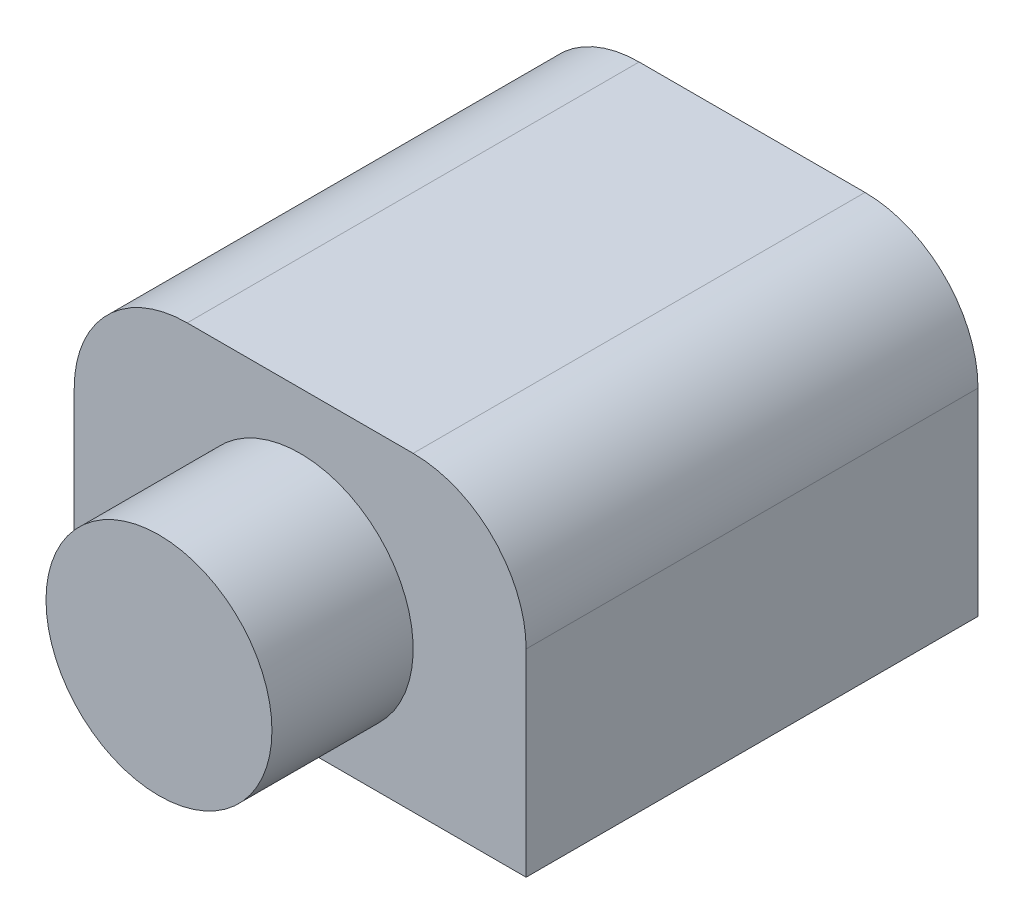
ISO-10303-21;
HEADER;
FILE_DESCRIPTION(('STEP AP214'),'2;1');
FILE_NAME('part.step','',(''),(''),'','','');
FILE_SCHEMA(('AUTOMOTIVE_DESIGN { 1 0 10303 214 1 1 1 1 }'));
ENDSEC;
DATA;
#1=APPLICATION_CONTEXT('core data for automotive mechanical design processes');
#2=APPLICATION_PROTOCOL_DEFINITION('international standard','automotive_design',2000,#1);
#3=PRODUCT_CONTEXT('',#1,'mechanical');
#4=PRODUCT('Part','Part','',(#3));
#5=PRODUCT_RELATED_PRODUCT_CATEGORY('part','',(#4));
#6=PRODUCT_DEFINITION_FORMATION('','',#4);
#7=PRODUCT_DEFINITION_CONTEXT('part definition',#1,'design');
#8=PRODUCT_DEFINITION('design','',#6,#7);
#9=PRODUCT_DEFINITION_SHAPE('','',#8);
#10=(LENGTH_UNIT() NAMED_UNIT(*) SI_UNIT(.MILLI.,.METRE.));
#11=(NAMED_UNIT(*) PLANE_ANGLE_UNIT() SI_UNIT($,.RADIAN.));
#12=(NAMED_UNIT(*) SI_UNIT($,.STERADIAN.) SOLID_ANGLE_UNIT());
#13=UNCERTAINTY_MEASURE_WITH_UNIT(LENGTH_MEASURE(1.E-05),#10,'distance_accuracy_value','');
#14=(GEOMETRIC_REPRESENTATION_CONTEXT(3) GLOBAL_UNCERTAINTY_ASSIGNED_CONTEXT((#13)) GLOBAL_UNIT_ASSIGNED_CONTEXT((#10,
#11,#12)) REPRESENTATION_CONTEXT('',''));
#15=CARTESIAN_POINT('',(0.,0.,0.));
#16=DIRECTION('',(0.,0.,1.));
#17=DIRECTION('',(1.,0.,0.));
#18=AXIS2_PLACEMENT_3D('',#15,#16,#17);
#19=CARTESIAN_POINT('',(-40.,190.,40.));
#20=DIRECTION('',(1.,0.,0.));
#21=DIRECTION('',(0.,0.,-1.));
#22=AXIS2_PLACEMENT_3D('',#19,#20,#21);
#23=PLANE('',#22);
#24=DIRECTION('',(0.,-1.,0.));
#25=VECTOR('',#24,1.);
#26=CARTESIAN_POINT('',(-40.,190.,-40.));
#27=LINE('',#26,#25);
#28=CARTESIAN_POINT('',(-40.,170.,-40.));
#29=VERTEX_POINT('',#28);
#30=CARTESIAN_POINT('',(-40.,135.,-40.));
#31=VERTEX_POINT('',#30);
#32=EDGE_CURVE('E112',#29,#31,#27,.T.);
#33=ORIENTED_EDGE('',*,*,#32,.T.);
#34=DIRECTION('',(0.,0.,1.));
#35=VECTOR('',#34,1.);
#36=CARTESIAN_POINT('',(-40.,135.,40.));
#37=LINE('',#36,#35);
#38=CARTESIAN_POINT('',(-40.,135.,40.));
#39=VERTEX_POINT('',#38);
#40=EDGE_CURVE('E61',#31,#39,#37,.T.);
#41=ORIENTED_EDGE('',*,*,#40,.T.);
#42=DIRECTION('',(0.,-1.,0.));
#43=VECTOR('',#42,1.);
#44=CARTESIAN_POINT('',(-40.,190.,40.));
#45=LINE('',#44,#43);
#46=CARTESIAN_POINT('',(-40.,170.,40.));
#47=VERTEX_POINT('',#46);
#48=EDGE_CURVE('E114',#47,#39,#45,.T.);
#49=ORIENTED_EDGE('',*,*,#48,.F.);
#50=DIRECTION('',(0.,0.,1.));
#51=VECTOR('',#50,1.);
#52=CARTESIAN_POINT('',(-40.,170.,-40.));
#53=LINE('',#52,#51);
#54=EDGE_CURVE('E132',#47,#29,#53,.F.);
#55=ORIENTED_EDGE('',*,*,#54,.T.);
#56=EDGE_LOOP('',(#33,#41,#49,#55));
#57=FACE_BOUND('',#56,.T.);
#58=ADVANCED_FACE('F46',(#57),#23,.F.);
#59=CARTESIAN_POINT('',(40.,190.,40.));
#60=DIRECTION('',(0.,0.,-1.));
#61=DIRECTION('',(-1.,0.,0.));
#62=AXIS2_PLACEMENT_3D('',#59,#60,#61);
#63=PLANE('',#62);
#64=CARTESIAN_POINT('',(0.,160.,40.));
#65=DIRECTION('',(0.,0.,-1.));
#66=DIRECTION('',(-1.,0.,0.));
#67=AXIS2_PLACEMENT_3D('',#64,#65,#66);
#68=CIRCLE('',#67,20.);
#69=CARTESIAN_POINT('',(-20.,160.,40.));
#70=VERTEX_POINT('',#69);
#71=EDGE_CURVE('E54',#70,#70,#68,.F.);
#72=ORIENTED_EDGE('',*,*,#71,.F.);
#73=EDGE_LOOP('',(#72));
#74=FACE_BOUND('',#73,.T.);
#75=ORIENTED_EDGE('',*,*,#48,.T.);
#76=DIRECTION('',(1.,0.,0.));
#77=VECTOR('',#76,1.);
#78=CARTESIAN_POINT('',(40.,135.,40.));
#79=LINE('',#78,#77);
#80=CARTESIAN_POINT('',(40.,135.,40.));
#81=VERTEX_POINT('',#80);
#82=EDGE_CURVE('E109',#39,#81,#79,.T.);
#83=ORIENTED_EDGE('',*,*,#82,.T.);
#84=DIRECTION('',(0.,-1.,0.));
#85=VECTOR('',#84,1.);
#86=CARTESIAN_POINT('',(40.,190.,40.));
#87=LINE('',#86,#85);
#88=CARTESIAN_POINT('',(40.,170.,40.));
#89=VERTEX_POINT('',#88);
#90=EDGE_CURVE('E108',#89,#81,#87,.T.);
#91=ORIENTED_EDGE('',*,*,#90,.F.);
#92=CARTESIAN_POINT('',(20.,170.,40.));
#93=DIRECTION('',(0.,0.,-1.));
#94=DIRECTION('',(-1.,0.,0.));
#95=AXIS2_PLACEMENT_3D('',#92,#93,#94);
#96=CIRCLE('',#95,20.);
#97=CARTESIAN_POINT('',(20.,190.,40.));
#98=VERTEX_POINT('',#97);
#99=EDGE_CURVE('E128',#89,#98,#96,.F.);
#100=ORIENTED_EDGE('',*,*,#99,.T.);
#101=DIRECTION('',(1.,0.,0.));
#102=VECTOR('',#101,1.);
#103=CARTESIAN_POINT('',(40.,190.,40.));
#104=LINE('',#103,#102);
#105=CARTESIAN_POINT('',(-20.,190.,40.));
#106=VERTEX_POINT('',#105);
#107=EDGE_CURVE('E160',#106,#98,#104,.T.);
#108=ORIENTED_EDGE('',*,*,#107,.F.);
#109=CARTESIAN_POINT('',(-20.,170.,40.));
#110=DIRECTION('',(0.,0.,-1.));
#111=DIRECTION('',(-1.,0.,0.));
#112=AXIS2_PLACEMENT_3D('',#109,#110,#111);
#113=CIRCLE('',#112,20.);
#114=EDGE_CURVE('E130',#106,#47,#113,.F.);
#115=ORIENTED_EDGE('',*,*,#114,.T.);
#116=EDGE_LOOP('',(#75,#83,#91,#100,#108,#115));
#117=FACE_BOUND('',#116,.T.);
#118=ADVANCED_FACE('F143',(#74,#117),#63,.F.);
#119=CARTESIAN_POINT('',(40.,190.,40.));
#120=DIRECTION('',(-1.,0.,0.));
#121=DIRECTION('',(0.,0.,1.));
#122=AXIS2_PLACEMENT_3D('',#119,#120,#121);
#123=PLANE('',#122);
#124=ORIENTED_EDGE('',*,*,#90,.T.);
#125=DIRECTION('',(0.,0.,-1.));
#126=VECTOR('',#125,1.);
#127=CARTESIAN_POINT('',(40.,135.,40.));
#128=LINE('',#127,#126);
#129=CARTESIAN_POINT('',(40.,135.,-40.));
#130=VERTEX_POINT('',#129);
#131=EDGE_CURVE('E98',#81,#130,#128,.T.);
#132=ORIENTED_EDGE('',*,*,#131,.T.);
#133=DIRECTION('',(0.,-1.,0.));
#134=VECTOR('',#133,1.);
#135=CARTESIAN_POINT('',(40.,190.,-40.));
#136=LINE('',#135,#134);
#137=CARTESIAN_POINT('',(40.,170.,-40.));
#138=VERTEX_POINT('',#137);
#139=EDGE_CURVE('E105',#138,#130,#136,.T.);
#140=ORIENTED_EDGE('',*,*,#139,.F.);
#141=DIRECTION('',(0.,0.,-1.));
#142=VECTOR('',#141,1.);
#143=CARTESIAN_POINT('',(40.,170.,40.));
#144=LINE('',#143,#142);
#145=EDGE_CURVE('E137',#138,#89,#144,.F.);
#146=ORIENTED_EDGE('',*,*,#145,.T.);
#147=EDGE_LOOP('',(#124,#132,#140,#146));
#148=FACE_BOUND('',#147,.T.);
#149=ADVANCED_FACE('F104',(#148),#123,.F.);
#150=CARTESIAN_POINT('',(40.,190.,-40.));
#151=DIRECTION('',(0.,0.,1.));
#152=DIRECTION('',(1.,0.,0.));
#153=AXIS2_PLACEMENT_3D('',#150,#151,#152);
#154=PLANE('',#153);
#155=ORIENTED_EDGE('',*,*,#139,.T.);
#156=DIRECTION('',(-1.,0.,0.));
#157=VECTOR('',#156,1.);
#158=CARTESIAN_POINT('',(40.,135.,-40.));
#159=LINE('',#158,#157);
#160=EDGE_CURVE('E12',#130,#31,#159,.T.);
#161=ORIENTED_EDGE('',*,*,#160,.T.);
#162=ORIENTED_EDGE('',*,*,#32,.F.);
#163=CARTESIAN_POINT('',(-20.,170.,-40.));
#164=DIRECTION('',(0.,0.,1.));
#165=DIRECTION('',(1.,0.,0.));
#166=AXIS2_PLACEMENT_3D('',#163,#164,#165);
#167=CIRCLE('',#166,20.);
#168=CARTESIAN_POINT('',(-20.,190.,-40.));
#169=VERTEX_POINT('',#168);
#170=EDGE_CURVE('E135',#29,#169,#167,.F.);
#171=ORIENTED_EDGE('',*,*,#170,.T.);
#172=DIRECTION('',(-1.,0.,0.));
#173=VECTOR('',#172,1.);
#174=CARTESIAN_POINT('',(40.,190.,-40.));
#175=LINE('',#174,#173);
#176=CARTESIAN_POINT('',(20.,190.,-40.));
#177=VERTEX_POINT('',#176);
#178=EDGE_CURVE('E116',#177,#169,#175,.T.);
#179=ORIENTED_EDGE('',*,*,#178,.F.);
#180=CARTESIAN_POINT('',(20.,170.,-40.));
#181=DIRECTION('',(0.,0.,1.));
#182=DIRECTION('',(1.,0.,0.));
#183=AXIS2_PLACEMENT_3D('',#180,#181,#182);
#184=CIRCLE('',#183,20.);
#185=EDGE_CURVE('E68',#177,#138,#184,.F.);
#186=ORIENTED_EDGE('',*,*,#185,.T.);
#187=EDGE_LOOP('',(#155,#161,#162,#171,#179,#186));
#188=FACE_BOUND('',#187,.T.);
#189=ADVANCED_FACE('F111',(#188),#154,.F.);
#190=CARTESIAN_POINT('',(0.,190.,0.));
#191=DIRECTION('',(0.,1.,0.));
#192=DIRECTION('',(0.,0.,1.));
#193=AXIS2_PLACEMENT_3D('',#190,#191,#192);
#194=PLANE('',#193);
#195=ORIENTED_EDGE('',*,*,#178,.T.);
#196=DIRECTION('',(0.,0.,1.));
#197=VECTOR('',#196,1.);
#198=CARTESIAN_POINT('',(-20.,190.,40.));
#199=LINE('',#198,#197);
#200=EDGE_CURVE('E125',#169,#106,#199,.T.);
#201=ORIENTED_EDGE('',*,*,#200,.T.);
#202=ORIENTED_EDGE('',*,*,#107,.T.);
#203=DIRECTION('',(0.,0.,-1.));
#204=VECTOR('',#203,1.);
#205=CARTESIAN_POINT('',(20.,190.,-40.));
#206=LINE('',#205,#204);
#207=EDGE_CURVE('E122',#98,#177,#206,.T.);
#208=ORIENTED_EDGE('',*,*,#207,.T.);
#209=EDGE_LOOP('',(#195,#201,#202,#208));
#210=FACE_BOUND('',#209,.T.);
#211=ADVANCED_FACE('F157',(#210),#194,.T.);
#212=CARTESIAN_POINT('',(-20.,170.,0.));
#213=DIRECTION('',(0.,0.,-1.));
#214=DIRECTION('',(-1.,0.,0.));
#215=AXIS2_PLACEMENT_3D('',#212,#213,#214);
#216=CYLINDRICAL_SURFACE('',#215,20.);
#217=ORIENTED_EDGE('',*,*,#170,.F.);
#218=ORIENTED_EDGE('',*,*,#54,.F.);
#219=ORIENTED_EDGE('',*,*,#114,.F.);
#220=ORIENTED_EDGE('',*,*,#200,.F.);
#221=EDGE_LOOP('',(#217,#218,#219,#220));
#222=FACE_BOUND('',#221,.T.);
#223=ADVANCED_FACE('F153',(#222),#216,.T.);
#224=CARTESIAN_POINT('',(20.,170.,0.));
#225=DIRECTION('',(0.,0.,1.));
#226=DIRECTION('',(1.,0.,0.));
#227=AXIS2_PLACEMENT_3D('',#224,#225,#226);
#228=CYLINDRICAL_SURFACE('',#227,20.);
#229=ORIENTED_EDGE('',*,*,#99,.F.);
#230=ORIENTED_EDGE('',*,*,#145,.F.);
#231=ORIENTED_EDGE('',*,*,#185,.F.);
#232=ORIENTED_EDGE('',*,*,#207,.F.);
#233=EDGE_LOOP('',(#229,#230,#231,#232));
#234=FACE_BOUND('',#233,.T.);
#235=ADVANCED_FACE('F48',(#234),#228,.T.);
#236=CARTESIAN_POINT('',(0.,160.,65.));
#237=DIRECTION('',(0.,0.,-1.));
#238=DIRECTION('',(-1.,0.,0.));
#239=AXIS2_PLACEMENT_3D('',#236,#237,#238);
#240=CYLINDRICAL_SURFACE('',#239,20.);
#241=CARTESIAN_POINT('',(0.,160.,65.));
#242=DIRECTION('',(0.,0.,1.));
#243=DIRECTION('',(1.,0.,0.));
#244=AXIS2_PLACEMENT_3D('',#241,#242,#243);
#245=CIRCLE('',#244,20.);
#246=CARTESIAN_POINT('',(20.,160.,65.));
#247=VERTEX_POINT('',#246);
#248=EDGE_CURVE('E161',#247,#247,#245,.T.);
#249=ORIENTED_EDGE('',*,*,#248,.F.);
#250=EDGE_LOOP('',(#249));
#251=FACE_BOUND('',#250,.T.);
#252=ORIENTED_EDGE('',*,*,#71,.T.);
#253=EDGE_LOOP('',(#252));
#254=FACE_BOUND('',#253,.T.);
#255=ADVANCED_FACE('F141',(#251,#254),#240,.T.);
#256=CARTESIAN_POINT('',(0.,160.,65.));
#257=DIRECTION('',(0.,0.,1.));
#258=DIRECTION('',(1.,0.,0.));
#259=AXIS2_PLACEMENT_3D('',#256,#257,#258);
#260=PLANE('',#259);
#261=ORIENTED_EDGE('',*,*,#248,.T.);
#262=EDGE_LOOP('',(#261));
#263=FACE_BOUND('',#262,.T.);
#264=ADVANCED_FACE('F169',(#263),#260,.T.);
#265=CARTESIAN_POINT('',(0.,135.,0.));
#266=DIRECTION('',(0.,-1.,0.));
#267=DIRECTION('',(0.,0.,-1.));
#268=AXIS2_PLACEMENT_3D('',#265,#266,#267);
#269=PLANE('',#268);
#270=ORIENTED_EDGE('',*,*,#40,.F.);
#271=ORIENTED_EDGE('',*,*,#160,.F.);
#272=ORIENTED_EDGE('',*,*,#131,.F.);
#273=ORIENTED_EDGE('',*,*,#82,.F.);
#274=EDGE_LOOP('',(#270,#271,#272,#273));
#275=FACE_BOUND('',#274,.T.);
#276=ADVANCED_FACE('F97',(#275),#269,.T.);
#277=CLOSED_SHELL('',(#58,#118,#149,#189,#211,#223,#235,#255,#264,#276));
#278=MANIFOLD_SOLID_BREP('B2',#277);
#279=ADVANCED_BREP_SHAPE_REPRESENTATION('',(#18,#278),#14);
#280=SHAPE_DEFINITION_REPRESENTATION(#9,#279);
ENDSEC;
END-ISO-10303-21;
